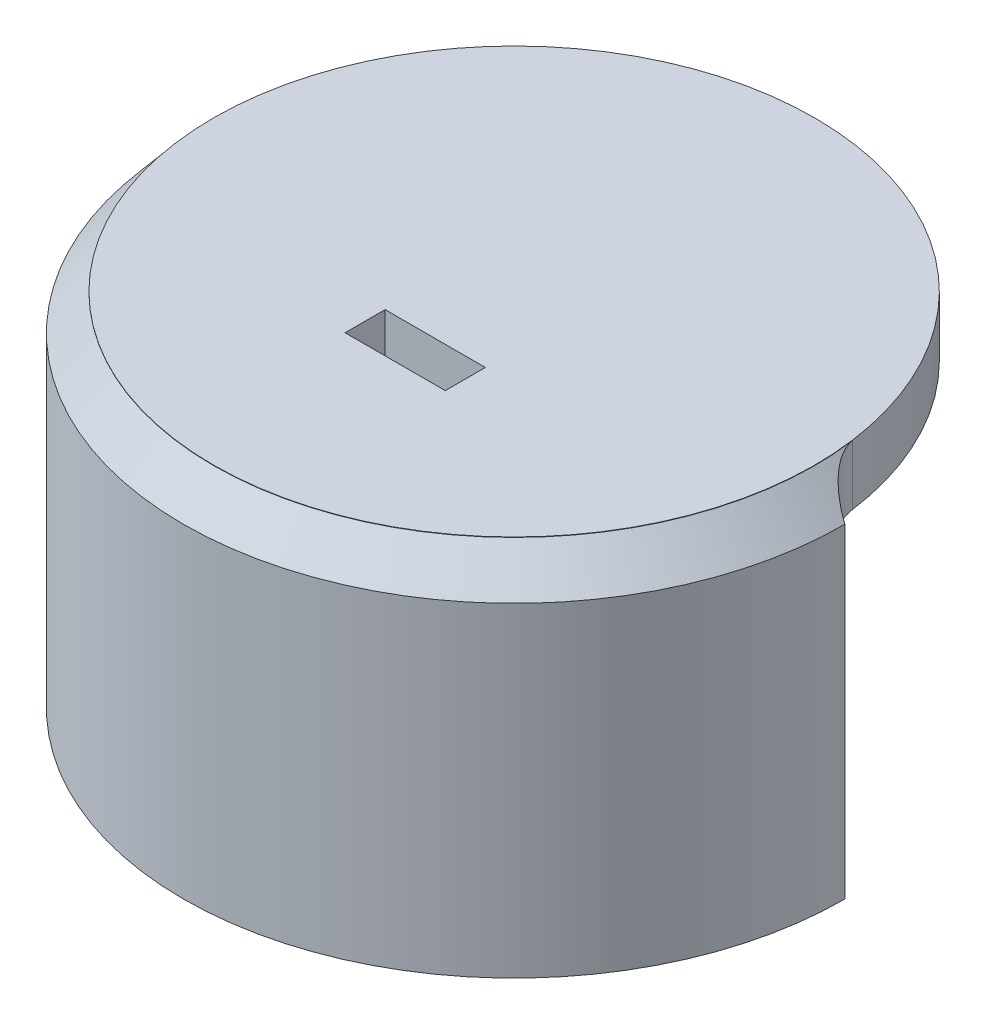
ISO-10303-21;
HEADER;
FILE_DESCRIPTION(('STEP AP214'),'2;1');
FILE_NAME('part.step','',(''),(''),'','','');
FILE_SCHEMA(('AUTOMOTIVE_DESIGN { 1 0 10303 214 1 1 1 1 }'));
ENDSEC;
DATA;
#1=APPLICATION_CONTEXT('core data for automotive mechanical design processes');
#2=APPLICATION_PROTOCOL_DEFINITION('international standard','automotive_design',2000,#1);
#3=PRODUCT_CONTEXT('',#1,'mechanical');
#4=PRODUCT('Part','Part','',(#3));
#5=PRODUCT_RELATED_PRODUCT_CATEGORY('part','',(#4));
#6=PRODUCT_DEFINITION_FORMATION('','',#4);
#7=PRODUCT_DEFINITION_CONTEXT('part definition',#1,'design');
#8=PRODUCT_DEFINITION('design','',#6,#7);
#9=PRODUCT_DEFINITION_SHAPE('','',#8);
#10=(LENGTH_UNIT() NAMED_UNIT(*) SI_UNIT(.MILLI.,.METRE.));
#11=(NAMED_UNIT(*) PLANE_ANGLE_UNIT() SI_UNIT($,.RADIAN.));
#12=(NAMED_UNIT(*) SI_UNIT($,.STERADIAN.) SOLID_ANGLE_UNIT());
#13=UNCERTAINTY_MEASURE_WITH_UNIT(LENGTH_MEASURE(1.E-05),#10,'distance_accuracy_value','');
#14=(GEOMETRIC_REPRESENTATION_CONTEXT(3) GLOBAL_UNCERTAINTY_ASSIGNED_CONTEXT((#13)) GLOBAL_UNIT_ASSIGNED_CONTEXT((#10,
#11,#12)) REPRESENTATION_CONTEXT('',''));
#15=CARTESIAN_POINT('',(0.,0.,0.));
#16=DIRECTION('',(0.,0.,1.));
#17=DIRECTION('',(1.,0.,0.));
#18=AXIS2_PLACEMENT_3D('',#15,#16,#17);
#19=CARTESIAN_POINT('',(0.,30.,0.));
#20=DIRECTION('',(0.,-1.,0.));
#21=DIRECTION('',(0.,0.,-1.));
#22=AXIS2_PLACEMENT_3D('',#19,#20,#21);
#23=CYLINDRICAL_SURFACE('',#22,25.);
#24=CARTESIAN_POINT('',(0.,0.,0.));
#25=DIRECTION('',(0.,-1.,0.));
#26=DIRECTION('',(0.,0.,-1.));
#27=AXIS2_PLACEMENT_3D('',#24,#25,#26);
#28=CIRCLE('',#27,25.);
#29=CARTESIAN_POINT('',(25.,0.,0.));
#30=VERTEX_POINT('',#29);
#31=CARTESIAN_POINT('',(-25.,0.,0.));
#32=VERTEX_POINT('',#31);
#33=EDGE_CURVE('E187',#30,#32,#28,.T.);
#34=ORIENTED_EDGE('',*,*,#33,.T.);
#35=DIRECTION('',(0.,-1.,0.));
#36=VECTOR('',#35,1.);
#37=CARTESIAN_POINT('',(-25.,30.,0.));
#38=LINE('',#37,#36);
#39=CARTESIAN_POINT('',(-25.,30.,0.));
#40=VERTEX_POINT('',#39);
#41=EDGE_CURVE('E226',#40,#32,#38,.T.);
#42=ORIENTED_EDGE('',*,*,#41,.F.);
#43=CARTESIAN_POINT('',(0.,30.,0.));
#44=DIRECTION('',(0.,-1.,0.));
#45=DIRECTION('',(0.,0.,-1.));
#46=AXIS2_PLACEMENT_3D('',#43,#44,#45);
#47=CIRCLE('',#46,25.);
#48=CARTESIAN_POINT('',(25.,30.,0.));
#49=VERTEX_POINT('',#48);
#50=EDGE_CURVE('E191',#49,#40,#47,.T.);
#51=ORIENTED_EDGE('',*,*,#50,.F.);
#52=DIRECTION('',(0.,-1.,0.));
#53=VECTOR('',#52,1.);
#54=CARTESIAN_POINT('',(25.,30.,0.));
#55=LINE('',#54,#53);
#56=EDGE_CURVE('E199',#49,#30,#55,.T.);
#57=ORIENTED_EDGE('',*,*,#56,.T.);
#58=EDGE_LOOP('',(#34,#42,#51,#57));
#59=FACE_BOUND('',#58,.T.);
#60=ADVANCED_FACE('F45',(#59),#23,.F.);
#61=CARTESIAN_POINT('',(-33.,30.,0.));
#62=DIRECTION('',(0.,0.,1.));
#63=DIRECTION('',(1.,0.,0.));
#64=AXIS2_PLACEMENT_3D('',#61,#62,#63);
#65=PLANE('',#64);
#66=DIRECTION('',(0.,-1.,0.));
#67=VECTOR('',#66,1.);
#68=CARTESIAN_POINT('',(-33.,30.,0.));
#69=LINE('',#68,#67);
#70=CARTESIAN_POINT('',(-33.,30.,0.));
#71=VERTEX_POINT('',#70);
#72=CARTESIAN_POINT('',(-33.,0.,0.));
#73=VERTEX_POINT('',#72);
#74=EDGE_CURVE('E221',#71,#73,#69,.T.);
#75=ORIENTED_EDGE('',*,*,#74,.F.);
#76=DIRECTION('',(-1.,0.,0.));
#77=VECTOR('',#76,1.);
#78=CARTESIAN_POINT('',(-33.,30.,0.));
#79=LINE('',#78,#77);
#80=EDGE_CURVE('E61',#40,#71,#79,.T.);
#81=ORIENTED_EDGE('',*,*,#80,.F.);
#82=ORIENTED_EDGE('',*,*,#41,.T.);
#83=DIRECTION('',(-1.,0.,0.));
#84=VECTOR('',#83,1.);
#85=CARTESIAN_POINT('',(-33.,0.,0.));
#86=LINE('',#85,#84);
#87=EDGE_CURVE('E203',#32,#73,#86,.T.);
#88=ORIENTED_EDGE('',*,*,#87,.T.);
#89=EDGE_LOOP('',(#75,#81,#82,#88));
#90=FACE_BOUND('',#89,.T.);
#91=ADVANCED_FACE('F276',(#90),#65,.F.);
#92=CARTESIAN_POINT('',(0.,30.,0.));
#93=DIRECTION('',(0.,-1.,0.));
#94=DIRECTION('',(0.,0.,-1.));
#95=AXIS2_PLACEMENT_3D('',#92,#93,#94);
#96=CYLINDRICAL_SURFACE('',#95,33.);
#97=CARTESIAN_POINT('',(0.,0.,0.));
#98=DIRECTION('',(0.,1.,0.));
#99=DIRECTION('',(0.,0.,1.));
#100=AXIS2_PLACEMENT_3D('',#97,#98,#99);
#101=CIRCLE('',#100,33.);
#102=CARTESIAN_POINT('',(33.,0.,0.));
#103=VERTEX_POINT('',#102);
#104=EDGE_CURVE('E207',#73,#103,#101,.T.);
#105=ORIENTED_EDGE('',*,*,#104,.T.);
#106=DIRECTION('',(0.,-1.,0.));
#107=VECTOR('',#106,1.);
#108=CARTESIAN_POINT('',(33.,30.,0.));
#109=LINE('',#108,#107);
#110=CARTESIAN_POINT('',(33.,30.,0.));
#111=VERTEX_POINT('',#110);
#112=EDGE_CURVE('E216',#111,#103,#109,.T.);
#113=ORIENTED_EDGE('',*,*,#112,.F.);
#114=CARTESIAN_POINT('',(33.,32.3835071851885,0.));
#115=VERTEX_POINT('',#114);
#116=EDGE_CURVE('E217',#115,#111,#109,.T.);
#117=ORIENTED_EDGE('',*,*,#116,.F.);
#118=CARTESIAN_POINT('',(0.,32.3835071851885,0.));
#119=DIRECTION('',(0.,-1.,0.));
#120=DIRECTION('',(0.,0.,-1.));
#121=AXIS2_PLACEMENT_3D('',#118,#119,#120);
#122=CIRCLE('',#121,33.);
#123=CARTESIAN_POINT('',(-33.,32.3835071851885,0.));
#124=VERTEX_POINT('',#123);
#125=EDGE_CURVE('E233',#115,#124,#122,.T.);
#126=ORIENTED_EDGE('',*,*,#125,.T.);
#127=EDGE_CURVE('E222',#124,#71,#69,.T.);
#128=ORIENTED_EDGE('',*,*,#127,.T.);
#129=ORIENTED_EDGE('',*,*,#74,.T.);
#130=EDGE_LOOP('',(#105,#113,#117,#126,#128,#129));
#131=FACE_BOUND('',#130,.T.);
#132=ADVANCED_FACE('F281',(#131),#96,.T.);
#133=CARTESIAN_POINT('',(25.,30.,0.));
#134=DIRECTION('',(0.,0.,1.));
#135=DIRECTION('',(1.,0.,0.));
#136=AXIS2_PLACEMENT_3D('',#133,#134,#135);
#137=PLANE('',#136);
#138=DIRECTION('',(-1.,0.,0.));
#139=VECTOR('',#138,1.);
#140=CARTESIAN_POINT('',(25.,30.,0.));
#141=LINE('',#140,#139);
#142=EDGE_CURVE('E69',#111,#49,#141,.T.);
#143=ORIENTED_EDGE('',*,*,#142,.F.);
#144=ORIENTED_EDGE('',*,*,#112,.T.);
#145=DIRECTION('',(-1.,0.,0.));
#146=VECTOR('',#145,1.);
#147=CARTESIAN_POINT('',(25.,0.,0.));
#148=LINE('',#147,#146);
#149=EDGE_CURVE('E194',#103,#30,#148,.T.);
#150=ORIENTED_EDGE('',*,*,#149,.T.);
#151=ORIENTED_EDGE('',*,*,#56,.F.);
#152=EDGE_LOOP('',(#143,#144,#150,#151));
#153=FACE_BOUND('',#152,.T.);
#154=ADVANCED_FACE('F287',(#153),#137,.F.);
#155=CARTESIAN_POINT('',(0.,0.,0.));
#156=DIRECTION('',(0.,-1.,0.));
#157=DIRECTION('',(0.,0.,-1.));
#158=AXIS2_PLACEMENT_3D('',#155,#156,#157);
#159=PLANE('',#158);
#160=ORIENTED_EDGE('',*,*,#33,.F.);
#161=ORIENTED_EDGE('',*,*,#149,.F.);
#162=ORIENTED_EDGE('',*,*,#104,.F.);
#163=ORIENTED_EDGE('',*,*,#87,.F.);
#164=EDGE_LOOP('',(#160,#161,#162,#163));
#165=FACE_BOUND('',#164,.T.);
#166=ADVANCED_FACE('F291',(#165),#159,.T.);
#167=CARTESIAN_POINT('',(0.,30.,0.));
#168=DIRECTION('',(0.,1.,0.));
#169=DIRECTION('',(0.,0.,1.));
#170=AXIS2_PLACEMENT_3D('',#167,#168,#169);
#171=PLANE('',#170);
#172=DIRECTION('',(1.,0.,0.));
#173=VECTOR('',#172,1.);
#174=CARTESIAN_POINT('',(5.13020083021142,30.,8.));
#175=LINE('',#174,#173);
#176=CARTESIAN_POINT('',(-4.86979916978858,30.,8.));
#177=VERTEX_POINT('',#176);
#178=CARTESIAN_POINT('',(5.13020083021142,30.,8.));
#179=VERTEX_POINT('',#178);
#180=EDGE_CURVE('E156',#177,#179,#175,.T.);
#181=ORIENTED_EDGE('',*,*,#180,.F.);
#182=DIRECTION('',(0.,0.,-1.));
#183=VECTOR('',#182,1.);
#184=CARTESIAN_POINT('',(-4.86979916978858,30.,8.));
#185=LINE('',#184,#183);
#186=CARTESIAN_POINT('',(-4.86979916978858,30.,12.));
#187=VERTEX_POINT('',#186);
#188=EDGE_CURVE('E133',#187,#177,#185,.T.);
#189=ORIENTED_EDGE('',*,*,#188,.F.);
#190=DIRECTION('',(-1.,0.,0.));
#191=VECTOR('',#190,1.);
#192=CARTESIAN_POINT('',(5.13020083021142,30.,12.));
#193=LINE('',#192,#191);
#194=CARTESIAN_POINT('',(5.13020083021142,30.,12.));
#195=VERTEX_POINT('',#194);
#196=EDGE_CURVE('E146',#195,#187,#193,.T.);
#197=ORIENTED_EDGE('',*,*,#196,.F.);
#198=DIRECTION('',(0.,0.,1.));
#199=VECTOR('',#198,1.);
#200=CARTESIAN_POINT('',(5.13020083021142,30.,8.));
#201=LINE('',#200,#199);
#202=EDGE_CURVE('E163',#179,#195,#201,.T.);
#203=ORIENTED_EDGE('',*,*,#202,.F.);
#204=EDGE_LOOP('',(#181,#189,#197,#203));
#205=FACE_BOUND('',#204,.T.);
#206=ORIENTED_EDGE('',*,*,#50,.T.);
#207=ORIENTED_EDGE('',*,*,#80,.T.);
#208=CARTESIAN_POINT('',(-34.6818181818182,30.,-4.70866091402918));
#209=DIRECTION('',(0.,1.,0.));
#210=DIRECTION('',(0.,0.,1.));
#211=AXIS2_PLACEMENT_3D('',#208,#209,#210);
#212=CIRCLE('',#211,5.);
#213=CARTESIAN_POINT('',(-29.7272727272727,30.,-4.03599506916787));
#214=VERTEX_POINT('',#213);
#215=EDGE_CURVE('E11',#71,#214,#212,.T.);
#216=ORIENTED_EDGE('',*,*,#215,.T.);
#217=CARTESIAN_POINT('',(0.,30.,0.));
#218=DIRECTION('',(0.,1.,0.));
#219=DIRECTION('',(0.,0.,1.));
#220=AXIS2_PLACEMENT_3D('',#217,#218,#219);
#221=CIRCLE('',#220,30.);
#222=CARTESIAN_POINT('',(29.7272727272727,30.,-4.03599506916787));
#223=VERTEX_POINT('',#222);
#224=EDGE_CURVE('E151',#223,#214,#221,.T.);
#225=ORIENTED_EDGE('',*,*,#224,.F.);
#226=CARTESIAN_POINT('',(34.6818181818182,30.,-4.70866091402918));
#227=DIRECTION('',(0.,1.,0.));
#228=DIRECTION('',(0.,0.,1.));
#229=AXIS2_PLACEMENT_3D('',#226,#227,#228);
#230=CIRCLE('',#229,5.);
#231=EDGE_CURVE('E245',#223,#111,#230,.T.);
#232=ORIENTED_EDGE('',*,*,#231,.T.);
#233=ORIENTED_EDGE('',*,*,#142,.T.);
#234=EDGE_LOOP('',(#206,#207,#216,#225,#232,#233));
#235=FACE_BOUND('',#234,.T.);
#236=ADVANCED_FACE('F154',(#205,#235),#171,.F.);
#237=CARTESIAN_POINT('',(0.,36.,0.));
#238=DIRECTION('',(0.,-1.,0.));
#239=DIRECTION('',(0.,0.,-1.));
#240=AXIS2_PLACEMENT_3D('',#237,#238,#239);
#241=CYLINDRICAL_SURFACE('',#240,30.);
#242=CARTESIAN_POINT('',(0.,36.,0.));
#243=DIRECTION('',(0.,1.,0.));
#244=DIRECTION('',(0.,0.,1.));
#245=AXIS2_PLACEMENT_3D('',#242,#243,#244);
#246=CIRCLE('',#245,30.);
#247=CARTESIAN_POINT('',(0.,36.,30.));
#248=VERTEX_POINT('',#247);
#249=EDGE_CURVE('E183',#248,#248,#246,.T.);
#250=ORIENTED_EDGE('',*,*,#249,.F.);
#251=EDGE_LOOP('',(#250));
#252=FACE_BOUND('',#251,.T.);
#253=CARTESIAN_POINT('',(0.,35.9587679629712,0.));
#254=DIRECTION('',(0.,-1.,0.));
#255=DIRECTION('',(0.,0.,-1.));
#256=AXIS2_PLACEMENT_3D('',#253,#254,#255);
#257=CIRCLE('',#256,30.);
#258=CARTESIAN_POINT('',(-29.7272727272727,35.9587679629712,-4.03599506916787));
#259=VERTEX_POINT('',#258);
#260=CARTESIAN_POINT('',(29.7272727272727,35.9587679629712,-4.03599506916787));
#261=VERTEX_POINT('',#260);
#262=EDGE_CURVE('E230',#259,#261,#257,.F.);
#263=ORIENTED_EDGE('',*,*,#262,.T.);
#264=DIRECTION('',(0.,-1.,0.));
#265=VECTOR('',#264,1.);
#266=CARTESIAN_POINT('',(29.7272727272727,36.,-4.03599506916787));
#267=LINE('',#266,#265);
#268=EDGE_CURVE('E241',#261,#223,#267,.T.);
#269=ORIENTED_EDGE('',*,*,#268,.T.);
#270=ORIENTED_EDGE('',*,*,#224,.T.);
#271=DIRECTION('',(0.,-1.,0.));
#272=VECTOR('',#271,1.);
#273=CARTESIAN_POINT('',(-29.7272727272727,36.,-4.03599506916787));
#274=LINE('',#273,#272);
#275=EDGE_CURVE('E237',#214,#259,#274,.F.);
#276=ORIENTED_EDGE('',*,*,#275,.T.);
#277=EDGE_LOOP('',(#263,#269,#270,#276));
#278=FACE_BOUND('',#277,.T.);
#279=ADVANCED_FACE('F295',(#252,#278),#241,.T.);
#280=CARTESIAN_POINT('',(0.,36.,0.));
#281=DIRECTION('',(0.,1.,0.));
#282=DIRECTION('',(0.,0.,1.));
#283=AXIS2_PLACEMENT_3D('',#280,#281,#282);
#284=PLANE('',#283);
#285=DIRECTION('',(0.,0.,1.));
#286=VECTOR('',#285,1.);
#287=CARTESIAN_POINT('',(-4.86979916978858,36.,8.));
#288=LINE('',#287,#286);
#289=CARTESIAN_POINT('',(-4.86979916978858,36.,8.));
#290=VERTEX_POINT('',#289);
#291=CARTESIAN_POINT('',(-4.86979916978858,36.,12.));
#292=VERTEX_POINT('',#291);
#293=EDGE_CURVE('E136',#290,#292,#288,.T.);
#294=ORIENTED_EDGE('',*,*,#293,.F.);
#295=DIRECTION('',(-1.,0.,0.));
#296=VECTOR('',#295,1.);
#297=CARTESIAN_POINT('',(5.13020083021142,36.,8.));
#298=LINE('',#297,#296);
#299=CARTESIAN_POINT('',(5.13020083021142,36.,8.));
#300=VERTEX_POINT('',#299);
#301=EDGE_CURVE('E142',#300,#290,#298,.T.);
#302=ORIENTED_EDGE('',*,*,#301,.F.);
#303=DIRECTION('',(0.,0.,-1.));
#304=VECTOR('',#303,1.);
#305=CARTESIAN_POINT('',(5.13020083021142,36.,8.));
#306=LINE('',#305,#304);
#307=CARTESIAN_POINT('',(5.13020083021142,36.,12.));
#308=VERTEX_POINT('',#307);
#309=EDGE_CURVE('E169',#308,#300,#306,.T.);
#310=ORIENTED_EDGE('',*,*,#309,.F.);
#311=DIRECTION('',(1.,0.,0.));
#312=VECTOR('',#311,1.);
#313=CARTESIAN_POINT('',(5.13020083021142,36.,12.));
#314=LINE('',#313,#312);
#315=EDGE_CURVE('E161',#292,#308,#314,.T.);
#316=ORIENTED_EDGE('',*,*,#315,.F.);
#317=EDGE_LOOP('',(#294,#302,#310,#316));
#318=FACE_BOUND('',#317,.T.);
#319=ORIENTED_EDGE('',*,*,#249,.T.);
#320=EDGE_LOOP('',(#319));
#321=FACE_BOUND('',#320,.T.);
#322=ADVANCED_FACE('F298',(#318,#321),#284,.T.);
#323=CARTESIAN_POINT('',(-4.86979916978858,-0.001000000000001,8.));
#324=DIRECTION('',(-1.,0.,0.));
#325=DIRECTION('',(0.,0.,1.));
#326=AXIS2_PLACEMENT_3D('',#323,#324,#325);
#327=PLANE('',#326);
#328=ORIENTED_EDGE('',*,*,#188,.T.);
#329=DIRECTION('',(0.,1.,0.));
#330=VECTOR('',#329,1.);
#331=CARTESIAN_POINT('',(-4.86979916978858,-0.001000000000001,8.));
#332=LINE('',#331,#330);
#333=EDGE_CURVE('E152',#177,#290,#332,.T.);
#334=ORIENTED_EDGE('',*,*,#333,.T.);
#335=ORIENTED_EDGE('',*,*,#293,.T.);
#336=DIRECTION('',(0.,1.,0.));
#337=VECTOR('',#336,1.);
#338=CARTESIAN_POINT('',(-4.86979916978858,-0.001000000000001,12.));
#339=LINE('',#338,#337);
#340=EDGE_CURVE('E129',#187,#292,#339,.T.);
#341=ORIENTED_EDGE('',*,*,#340,.F.);
#342=EDGE_LOOP('',(#328,#334,#335,#341));
#343=FACE_BOUND('',#342,.T.);
#344=ADVANCED_FACE('F131',(#343),#327,.F.);
#345=CARTESIAN_POINT('',(5.13020083021142,-0.001000000000001,8.));
#346=DIRECTION('',(0.,0.,-1.));
#347=DIRECTION('',(-1.,0.,0.));
#348=AXIS2_PLACEMENT_3D('',#345,#346,#347);
#349=PLANE('',#348);
#350=ORIENTED_EDGE('',*,*,#180,.T.);
#351=DIRECTION('',(0.,1.,0.));
#352=VECTOR('',#351,1.);
#353=CARTESIAN_POINT('',(5.13020083021142,-0.001000000000001,8.));
#354=LINE('',#353,#352);
#355=EDGE_CURVE('E178',#179,#300,#354,.T.);
#356=ORIENTED_EDGE('',*,*,#355,.T.);
#357=ORIENTED_EDGE('',*,*,#301,.T.);
#358=ORIENTED_EDGE('',*,*,#333,.F.);
#359=EDGE_LOOP('',(#350,#356,#357,#358));
#360=FACE_BOUND('',#359,.T.);
#361=ADVANCED_FACE('F307',(#360),#349,.F.);
#362=CARTESIAN_POINT('',(5.13020083021142,-0.001000000000001,8.));
#363=DIRECTION('',(1.,0.,0.));
#364=DIRECTION('',(0.,0.,-1.));
#365=AXIS2_PLACEMENT_3D('',#362,#363,#364);
#366=PLANE('',#365);
#367=ORIENTED_EDGE('',*,*,#202,.T.);
#368=DIRECTION('',(0.,1.,0.));
#369=VECTOR('',#368,1.);
#370=CARTESIAN_POINT('',(5.13020083021142,-0.001000000000001,12.));
#371=LINE('',#370,#369);
#372=EDGE_CURVE('E141',#195,#308,#371,.T.);
#373=ORIENTED_EDGE('',*,*,#372,.T.);
#374=ORIENTED_EDGE('',*,*,#309,.T.);
#375=ORIENTED_EDGE('',*,*,#355,.F.);
#376=EDGE_LOOP('',(#367,#373,#374,#375));
#377=FACE_BOUND('',#376,.T.);
#378=ADVANCED_FACE('F310',(#377),#366,.F.);
#379=CARTESIAN_POINT('',(5.13020083021142,-0.001000000000001,12.));
#380=DIRECTION('',(0.,0.,1.));
#381=DIRECTION('',(1.,0.,0.));
#382=AXIS2_PLACEMENT_3D('',#379,#380,#381);
#383=PLANE('',#382);
#384=ORIENTED_EDGE('',*,*,#196,.T.);
#385=ORIENTED_EDGE('',*,*,#340,.T.);
#386=ORIENTED_EDGE('',*,*,#315,.T.);
#387=ORIENTED_EDGE('',*,*,#372,.F.);
#388=EDGE_LOOP('',(#384,#385,#386,#387));
#389=FACE_BOUND('',#388,.T.);
#390=ADVANCED_FACE('F147',(#389),#383,.F.);
#391=CARTESIAN_POINT('',(0.,35.9587679629712,0.));
#392=DIRECTION('',(0.,-1.,0.));
#393=DIRECTION('',(0.,0.,-1.));
#394=AXIS2_PLACEMENT_3D('',#391,#392,#393);
#395=CONICAL_SURFACE('',#394,30.,0.698131700797727);
#396=ORIENTED_EDGE('',*,*,#262,.F.);
#397=CARTESIAN_POINT('',(-29.7272727272727,35.9587679629712,-4.03599506916787));
#398=CARTESIAN_POINT('',(-29.7410228303918,35.9588175262882,-3.93447015395474));
#399=CARTESIAN_POINT('',(-29.7579531128181,35.9543916853752,-3.83341380119118));
#400=CARTESIAN_POINT('',(-29.7977563150065,35.9369751735892,-3.63337745548443));
#401=CARTESIAN_POINT('',(-29.8206204636588,35.9239971009311,-3.53439462900698));
#402=CARTESIAN_POINT('',(-29.8715795921692,35.8900841770563,-3.34062099282514));
#403=CARTESIAN_POINT('',(-29.899601940123,35.8692560490718,-3.24579220371063));
#404=CARTESIAN_POINT('',(-29.9605424857693,35.8202656562403,-3.05967471165487));
#405=CARTESIAN_POINT('',(-29.9934621348028,35.7921012153735,-2.96838706829646));
#406=CARTESIAN_POINT('',(-30.0983320564555,35.6980257728196,-2.7016892732088));
#407=CARTESIAN_POINT('',(-30.1767331523019,35.6222979734873,-2.53219127647296));
#408=CARTESIAN_POINT('',(-30.3466597409256,35.4503471797776,-2.21072185691466));
#409=CARTESIAN_POINT('',(-30.4382284060973,35.3540562406753,-2.05881117699556));
#410=CARTESIAN_POINT('',(-30.6116060865163,35.1670489448304,-1.80136235675145));
#411=CARTESIAN_POINT('',(-30.6917024737401,35.0790715300103,-1.69262710644806));
#412=CARTESIAN_POINT('',(-30.856756115314,34.8953388163502,-1.48586499444847));
#413=CARTESIAN_POINT('',(-30.9417161097319,34.7995791201096,-1.38784426140787));
#414=CARTESIAN_POINT('',(-31.1157954873777,34.6015566592437,-1.20155393220101));
#415=CARTESIAN_POINT('',(-31.2049302007267,34.49926932888,-1.11332506620602));
#416=CARTESIAN_POINT('',(-31.386300722351,34.2897806977283,-0.946379990809287));
#417=CARTESIAN_POINT('',(-31.4785373455027,34.1825781029624,-0.867666306409235));
#418=CARTESIAN_POINT('',(-31.6863725022941,33.9399110308116,-0.702585877790195));
#419=CARTESIAN_POINT('',(-31.8025922683027,33.8034770337379,-0.618429384266247));
#420=CARTESIAN_POINT('',(-32.0380011127235,33.5261136723101,-0.462466577693127));
#421=CARTESIAN_POINT('',(-32.1571914979262,33.3851823216217,-0.390665813826242));
#422=CARTESIAN_POINT('',(-32.396076264474,33.1020766699259,-0.259652100041419));
#423=CARTESIAN_POINT('',(-32.5157362446155,32.9599527541394,-0.20026642818954));
#424=CARTESIAN_POINT('',(-32.7567077084393,32.673348040417,-0.0922460939962501));
#425=CARTESIAN_POINT('',(-32.8780170490084,32.5288702600872,-0.043598676181363));
#426=CARTESIAN_POINT('',(-33.,32.3835071851885,0.));
#427=B_SPLINE_CURVE_WITH_KNOTS('',3,(#397,#398,#399,#400,#401,#402,#403,#404,#405,#406,#407,
#408,#409,#410,#411,#412,#413,#414,#415,#416,#417,#418,#419,#420,#421,#422,#423,#424,#425,#426),
.UNSPECIFIED.,.F.,.F.,(4,2,2,2,2,2,2,2,2,2,2,2,2,2,4),(0.,0.30715197383731,0.613852493312909,
0.91652554150661,1.21928846781481,1.82091456911486,2.42456020177525,2.90743602005984,
3.39058661154739,3.87567701783653,4.36089586914818,4.95436323259731,5.54809644128832,
6.13292024330918,6.71704557660793),.UNSPECIFIED.);
#428=EDGE_CURVE('E55',#259,#124,#427,.T.);
#429=ORIENTED_EDGE('',*,*,#428,.T.);
#430=ORIENTED_EDGE('',*,*,#125,.F.);
#431=CARTESIAN_POINT('',(33.,32.3835071851885,0.));
#432=CARTESIAN_POINT('',(32.9195158802649,32.4794231722157,-0.0287516808993892));
#433=CARTESIAN_POINT('',(32.8393426577323,32.574926581649,-0.0597094490209147));
#434=CARTESIAN_POINT('',(32.6796972469322,32.7649593955724,-0.126194390824131));
#435=CARTESIAN_POINT('',(32.6002252130436,32.8594885863051,-0.161722545190117));
#436=CARTESIAN_POINT('',(32.3624036077644,33.1420759446073,-0.275679505826853));
#437=CARTESIAN_POINT('',(32.205289438465,33.3283692358062,-0.361254954836562));
#438=CARTESIAN_POINT('',(31.8930818423943,33.6971228417181,-0.554479181240771));
#439=CARTESIAN_POINT('',(31.7380638950834,33.8794700767236,-0.662467164611121));
#440=CARTESIAN_POINT('',(31.4347103943723,34.2338287403687,-0.901624315187708));
#441=CARTESIAN_POINT('',(31.2863624177331,34.4058596019936,-1.03274793825235));
#442=CARTESIAN_POINT('',(31.0767799510821,34.6459975524704,-1.24277471438045));
#443=CARTESIAN_POINT('',(31.0118965687333,34.7199090540415,-1.31147743182753));
#444=CARTESIAN_POINT('',(30.8844143455663,34.8640701837064,-1.45460010398254));
#445=CARTESIAN_POINT('',(30.8218155673363,34.9343197115005,-1.52902021514892));
#446=CARTESIAN_POINT('',(30.6384322927723,35.1381660173469,-1.76081442385337));
#447=CARTESIAN_POINT('',(30.5215838395527,35.2654098087507,-1.92719074001338));
#448=CARTESIAN_POINT('',(30.3189138535538,35.4789766425993,-2.25973448319408));
#449=CARTESIAN_POINT('',(30.2310460534449,35.5685514414709,-2.42250728063844));
#450=CARTESIAN_POINT('',(30.1109114367536,35.6848976433965,-2.67992373347165));
#451=CARTESIAN_POINT('',(30.0728384645956,35.7206543107075,-2.76785850069444));
#452=CARTESIAN_POINT('',(30.0011087452405,35.7854319474829,-2.94788590051361));
#453=CARTESIAN_POINT('',(29.9674491949539,35.8144572013539,-3.0399758435863));
#454=CARTESIAN_POINT('',(29.912530478794,35.8590167676066,-3.20546852925779));
#455=CARTESIAN_POINT('',(29.8902259849336,35.8761178749186,-3.27810698744446));
#456=CARTESIAN_POINT('',(29.8487514138165,35.9056910379348,-3.42518834654619));
#457=CARTESIAN_POINT('',(29.8295805451231,35.9181642634829,-3.49963078637201));
#458=CARTESIAN_POINT('',(29.7944568500075,35.9383200954784,-3.65048745318067));
#459=CARTESIAN_POINT('',(29.778528104359,35.9459676808558,-3.72691199652896));
#460=CARTESIAN_POINT('',(29.7502051564591,35.9562022959841,-3.88080186127435));
#461=CARTESIAN_POINT('',(29.7378134087741,35.9587858186932,-3.95826786656491));
#462=CARTESIAN_POINT('',(29.7272727272727,35.9587679629712,-4.03599506916787));
#463=B_SPLINE_CURVE_WITH_KNOTS('',3,(#431,#432,#433,#434,#435,#436,#437,#438,#439,#440,#441,
#442,#443,#444,#445,#446,#447,#448,#449,#450,#451,#452,#453,#454,#455,#456,#457,#458,#459,#460,
#461,#462),.UNSPECIFIED.,.F.,.F.,(4,2,2,2,2,2,2,2,2,2,2,2,2,2,2,4),(0.,0.385364170626137,
0.770811168592583,1.54476640635239,2.33142333859126,3.11654861595762,3.47627110190818,
3.83600343529753,4.55289012565902,5.16692555682288,5.47342331453877,5.77972545402813,
6.01318258726843,6.24658066654104,6.48165367048925,6.71688941334476),.UNSPECIFIED.);
#464=EDGE_CURVE('E248',#115,#261,#463,.T.);
#465=ORIENTED_EDGE('',*,*,#464,.T.);
#466=EDGE_LOOP('',(#396,#429,#430,#465));
#467=FACE_BOUND('',#466,.T.);
#468=ADVANCED_FACE('F261',(#467),#395,.T.);
#469=CARTESIAN_POINT('',(34.6818181818182,30.,-4.70866091402918));
#470=DIRECTION('',(0.,1.,0.));
#471=DIRECTION('',(0.,0.,1.));
#472=AXIS2_PLACEMENT_3D('',#469,#470,#471);
#473=CYLINDRICAL_SURFACE('',#472,5.);
#474=ORIENTED_EDGE('',*,*,#464,.F.);
#475=ORIENTED_EDGE('',*,*,#116,.T.);
#476=ORIENTED_EDGE('',*,*,#231,.F.);
#477=ORIENTED_EDGE('',*,*,#268,.F.);
#478=EDGE_LOOP('',(#474,#475,#476,#477));
#479=FACE_BOUND('',#478,.T.);
#480=ADVANCED_FACE('F264',(#479),#473,.F.);
#481=CARTESIAN_POINT('',(-34.6818181818182,30.,-4.70866091402918));
#482=DIRECTION('',(0.,-1.,0.));
#483=DIRECTION('',(0.,0.,-1.));
#484=AXIS2_PLACEMENT_3D('',#481,#482,#483);
#485=CYLINDRICAL_SURFACE('',#484,5.);
#486=ORIENTED_EDGE('',*,*,#215,.F.);
#487=ORIENTED_EDGE('',*,*,#127,.F.);
#488=ORIENTED_EDGE('',*,*,#428,.F.);
#489=ORIENTED_EDGE('',*,*,#275,.F.);
#490=EDGE_LOOP('',(#486,#487,#488,#489));
#491=FACE_BOUND('',#490,.T.);
#492=ADVANCED_FACE('F47',(#491),#485,.F.);
#493=CLOSED_SHELL('',(#60,#91,#132,#154,#166,#236,#279,#322,#344,#361,#378,#390,#468,#480,#492));
#494=MANIFOLD_SOLID_BREP('B2',#493);
#495=ADVANCED_BREP_SHAPE_REPRESENTATION('',(#18,#494),#14);
#496=SHAPE_DEFINITION_REPRESENTATION(#9,#495);
ENDSEC;
END-ISO-10303-21;
